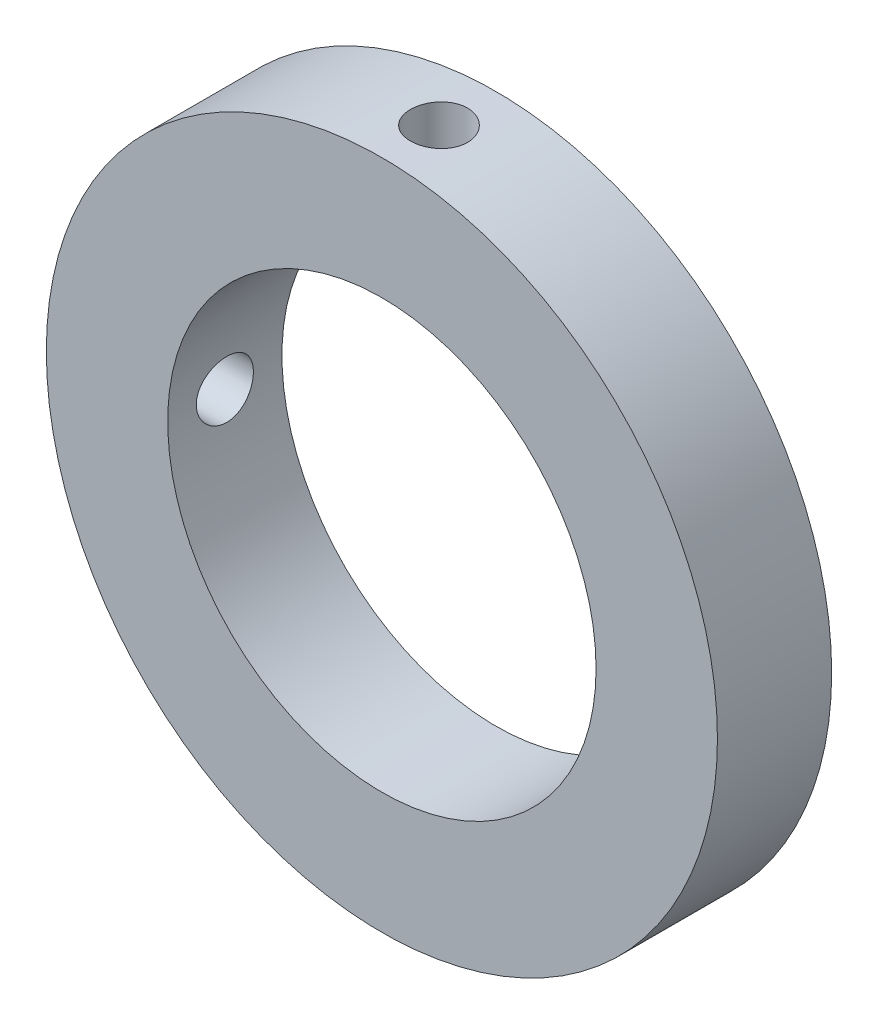
ISO-10303-21;
HEADER;
FILE_DESCRIPTION(('STEP AP214'),'2;1');
FILE_NAME('part.step','',(''),(''),'','','');
FILE_SCHEMA(('AUTOMOTIVE_DESIGN { 1 0 10303 214 1 1 1 1 }'));
ENDSEC;
DATA;
#1=APPLICATION_CONTEXT('core data for automotive mechanical design processes');
#2=APPLICATION_PROTOCOL_DEFINITION('international standard','automotive_design',2000,#1);
#3=PRODUCT_CONTEXT('',#1,'mechanical');
#4=PRODUCT('Part','Part','',(#3));
#5=PRODUCT_RELATED_PRODUCT_CATEGORY('part','',(#4));
#6=PRODUCT_DEFINITION_FORMATION('','',#4);
#7=PRODUCT_DEFINITION_CONTEXT('part definition',#1,'design');
#8=PRODUCT_DEFINITION('design','',#6,#7);
#9=PRODUCT_DEFINITION_SHAPE('','',#8);
#10=(LENGTH_UNIT() NAMED_UNIT(*) SI_UNIT(.MILLI.,.METRE.));
#11=(NAMED_UNIT(*) PLANE_ANGLE_UNIT() SI_UNIT($,.RADIAN.));
#12=(NAMED_UNIT(*) SI_UNIT($,.STERADIAN.) SOLID_ANGLE_UNIT());
#13=UNCERTAINTY_MEASURE_WITH_UNIT(LENGTH_MEASURE(1.E-05),#10,'distance_accuracy_value','');
#14=(GEOMETRIC_REPRESENTATION_CONTEXT(3) GLOBAL_UNCERTAINTY_ASSIGNED_CONTEXT((#13)) GLOBAL_UNIT_ASSIGNED_CONTEXT((#10,
#11,#12)) REPRESENTATION_CONTEXT('',''));
#15=CARTESIAN_POINT('',(0.,0.,0.));
#16=DIRECTION('',(0.,0.,1.));
#17=DIRECTION('',(1.,0.,0.));
#18=AXIS2_PLACEMENT_3D('',#15,#16,#17);
#19=CARTESIAN_POINT('',(0.,0.,8.));
#20=DIRECTION('',(0.,0.,1.));
#21=DIRECTION('',(1.,0.,0.));
#22=AXIS2_PLACEMENT_3D('',#19,#20,#21);
#23=PLANE('',#22);
#24=CARTESIAN_POINT('',(0.,0.,8.));
#25=DIRECTION('',(0.,0.,1.));
#26=DIRECTION('',(1.,0.,0.));
#27=AXIS2_PLACEMENT_3D('',#24,#25,#26);
#28=CIRCLE('',#27,23.5);
#29=CARTESIAN_POINT('',(23.5,0.,8.));
#30=VERTEX_POINT('',#29);
#31=EDGE_CURVE('E10',#30,#30,#28,.T.);
#32=ORIENTED_EDGE('',*,*,#31,.T.);
#33=EDGE_LOOP('',(#32));
#34=FACE_BOUND('',#33,.T.);
#35=CARTESIAN_POINT('',(0.,0.,8.));
#36=DIRECTION('',(0.,0.,1.));
#37=DIRECTION('',(1.,0.,0.));
#38=AXIS2_PLACEMENT_3D('',#35,#36,#37);
#39=CIRCLE('',#38,15.);
#40=CARTESIAN_POINT('',(15.,0.,8.));
#41=VERTEX_POINT('',#40);
#42=EDGE_CURVE('E44',#41,#41,#39,.T.);
#43=ORIENTED_EDGE('',*,*,#42,.F.);
#44=EDGE_LOOP('',(#43));
#45=FACE_BOUND('',#44,.T.);
#46=ADVANCED_FACE('F32',(#34,#45),#23,.T.);
#47=CARTESIAN_POINT('',(0.,0.,0.));
#48=DIRECTION('',(0.,0.,1.));
#49=DIRECTION('',(1.,0.,0.));
#50=AXIS2_PLACEMENT_3D('',#47,#48,#49);
#51=PLANE('',#50);
#52=CARTESIAN_POINT('',(0.,0.,0.));
#53=DIRECTION('',(0.,0.,1.));
#54=DIRECTION('',(1.,0.,0.));
#55=AXIS2_PLACEMENT_3D('',#52,#53,#54);
#56=CIRCLE('',#55,23.5);
#57=CARTESIAN_POINT('',(23.5,0.,0.));
#58=VERTEX_POINT('',#57);
#59=EDGE_CURVE('E37',#58,#58,#56,.T.);
#60=ORIENTED_EDGE('',*,*,#59,.F.);
#61=EDGE_LOOP('',(#60));
#62=FACE_BOUND('',#61,.T.);
#63=CARTESIAN_POINT('',(0.,0.,0.));
#64=DIRECTION('',(0.,0.,1.));
#65=DIRECTION('',(1.,0.,0.));
#66=AXIS2_PLACEMENT_3D('',#63,#64,#65);
#67=CIRCLE('',#66,15.);
#68=CARTESIAN_POINT('',(15.,0.,0.));
#69=VERTEX_POINT('',#68);
#70=EDGE_CURVE('E46',#69,#69,#67,.T.);
#71=ORIENTED_EDGE('',*,*,#70,.T.);
#72=EDGE_LOOP('',(#71));
#73=FACE_BOUND('',#72,.T.);
#74=ADVANCED_FACE('F78',(#62,#73),#51,.F.);
#75=CARTESIAN_POINT('',(0.,0.,8.));
#76=DIRECTION('',(0.,0.,-1.));
#77=DIRECTION('',(-1.,0.,0.));
#78=AXIS2_PLACEMENT_3D('',#75,#76,#77);
#79=CYLINDRICAL_SURFACE('',#78,23.5);
#80=CARTESIAN_POINT('',(-23.5,0.,6.));
#81=CARTESIAN_POINT('',(-23.4999988866651,-0.112123229769201,5.9999951065863));
#82=CARTESIAN_POINT('',(-23.4991890045528,-0.224322573517124,5.99053956778184));
#83=CARTESIAN_POINT('',(-23.4960360928998,-0.445616318942711,5.9529591232625));
#84=CARTESIAN_POINT('',(-23.4936913311316,-0.554707067003033,5.92481312343432));
#85=CARTESIAN_POINT('',(-23.4877336015421,-0.766546616788932,5.85067210537414));
#86=CARTESIAN_POINT('',(-23.4841213561534,-0.869298992076933,5.80468725325));
#87=CARTESIAN_POINT('',(-23.4760336376456,-1.06560228518032,5.69619221437259));
#88=CARTESIAN_POINT('',(-23.4715583479548,-1.1591551518568,5.63368553806174));
#89=CARTESIAN_POINT('',(-23.4622333709441,-1.33467623648226,5.49374233042156));
#90=CARTESIAN_POINT('',(-23.4573828278611,-1.41661669196157,5.41627103247056));
#91=CARTESIAN_POINT('',(-23.4478612006841,-1.56634871816151,5.24867124871695));
#92=CARTESIAN_POINT('',(-23.4431901245209,-1.63413966419486,5.15854220438072));
#93=CARTESIAN_POINT('',(-23.4345471555278,-1.75374279436174,4.96801662969354));
#94=CARTESIAN_POINT('',(-23.4305763378243,-1.80553049840485,4.86760467892561));
#95=CARTESIAN_POINT('',(-23.4237933648585,-1.89150071317162,4.65947102995426));
#96=CARTESIAN_POINT('',(-23.4209811883375,-1.92568354691007,4.55174946590893));
#97=CARTESIAN_POINT('',(-23.4168411560679,-1.97539297186546,4.33233314918643));
#98=CARTESIAN_POINT('',(-23.4155096948281,-1.99096488697627,4.22064873392267));
#99=CARTESIAN_POINT('',(-23.4144704730191,-2.00315047217665,3.99624409167833));
#100=CARTESIAN_POINT('',(-23.4147626807867,-1.99976451196352,3.8835238849395));
#101=CARTESIAN_POINT('',(-23.4169345031215,-1.97416791037035,3.6605581544508));
#102=CARTESIAN_POINT('',(-23.4188099620178,-1.95200654956399,3.55030692712201));
#103=CARTESIAN_POINT('',(-23.4239304529418,-1.88956480016654,3.33509468559295));
#104=CARTESIAN_POINT('',(-23.4271754988499,-1.84928422794199,3.23013372502014));
#105=CARTESIAN_POINT('',(-23.4346743098291,-1.75169237314649,3.02832456138188));
#106=CARTESIAN_POINT('',(-23.4389293815818,-1.69435900466839,2.93148708925001));
#107=CARTESIAN_POINT('',(-23.4479676066852,-1.56430495812446,2.74879112190973));
#108=CARTESIAN_POINT('',(-23.4527507711963,-1.49158395483874,2.66293285881005));
#109=CARTESIAN_POINT('',(-23.4623247268058,-1.33254263304903,2.50434598635165));
#110=CARTESIAN_POINT('',(-23.4671154936328,-1.24617971506071,2.43166009023105));
#111=CARTESIAN_POINT('',(-23.4761503430979,-1.06245464054071,2.3018115673023));
#112=CARTESIAN_POINT('',(-23.4803944253498,-0.96509247623753,2.24464895146223));
#113=CARTESIAN_POINT('',(-23.4878585742677,-0.762104721928345,2.14747219265524));
#114=CARTESIAN_POINT('',(-23.4910785263491,-0.656478208912319,2.10745996838497));
#115=CARTESIAN_POINT('',(-23.4961303162537,-0.439972968097537,2.04574983504057));
#116=CARTESIAN_POINT('',(-23.4979621841253,-0.329094354048099,2.02405152951734));
#117=CARTESIAN_POINT('',(-23.500027546738,-0.105602547297321,1.99963878359273));
#118=CARTESIAN_POINT('',(-23.5002660083826,0.00700415752780351,1.99686535074487));
#119=CARTESIAN_POINT('',(-23.4991309611319,0.231080915574299,2.01022649880017));
#120=CARTESIAN_POINT('',(-23.4977574679292,0.342550979850306,2.026360895634));
#121=CARTESIAN_POINT('',(-23.4935561570261,0.56102182056216,2.07703080729405));
#122=CARTESIAN_POINT('',(-23.4907305028014,0.668028990272134,2.11153895107965));
#123=CARTESIAN_POINT('',(-23.4839422526957,0.87473460698808,2.19794882390526));
#124=CARTESIAN_POINT('',(-23.4799796380928,0.97443293360727,2.24985083936804));
#125=CARTESIAN_POINT('',(-23.4713492002272,1.16395908728834,2.36972320517593));
#126=CARTESIAN_POINT('',(-23.4666796732491,1.25376213711802,2.43773260539869));
#127=CARTESIAN_POINT('',(-23.457165661042,1.42069837886321,2.5878328351477));
#128=CARTESIAN_POINT('',(-23.4523211726434,1.49783134111902,2.66992391986532));
#129=CARTESIAN_POINT('',(-23.4429885150815,1.63744048143301,2.84611338292093));
#130=CARTESIAN_POINT('',(-23.4385013022818,1.69987814155054,2.94024233982311));
#131=CARTESIAN_POINT('',(-23.4304049053355,1.80806012983393,3.13768349819379));
#132=CARTESIAN_POINT('',(-23.4267957121001,1.85380463080429,3.24099560458626));
#133=CARTESIAN_POINT('',(-23.4208694335715,1.92723628091616,3.45373444398497));
#134=CARTESIAN_POINT('',(-23.4185506662762,1.95494694423859,3.56315301176486));
#135=CARTESIAN_POINT('',(-23.4154621934875,1.99160084766112,3.78511044155885));
#136=CARTESIAN_POINT('',(-23.4146924568216,2.00054446542744,3.89764924073553));
#137=CARTESIAN_POINT('',(-23.4147896740478,1.99940595412868,4.1222697751252));
#138=CARTESIAN_POINT('',(-23.415651421826,1.98938434369543,4.23435182429875));
#139=CARTESIAN_POINT('',(-23.4189034453138,1.9507261135546,4.45523470737688));
#140=CARTESIAN_POINT('',(-23.4212937233022,1.922089466093,4.56403553638908));
#141=CARTESIAN_POINT('',(-23.4273321057134,1.84702952037953,4.77527102516025));
#142=CARTESIAN_POINT('',(-23.4309801280582,1.80060738275077,4.87770609982076));
#143=CARTESIAN_POINT('',(-23.4391230974554,1.69130092791677,5.07333883812549));
#144=CARTESIAN_POINT('',(-23.4436180320565,1.62841685272985,5.1665366375455));
#145=CARTESIAN_POINT('',(-23.4529654331836,1.48774412655109,5.34135906815437));
#146=CARTESIAN_POINT('',(-23.4578189478076,1.40991062623021,5.42294755481655));
#147=CARTESIAN_POINT('',(-23.4673270625175,1.24163079387903,5.57193609856443));
#148=CARTESIAN_POINT('',(-23.4719816142385,1.15118141763705,5.63933272127201));
#149=CARTESIAN_POINT('',(-23.4805761121491,0.960055887668371,5.75811883935542));
#150=CARTESIAN_POINT('',(-23.4845146659951,0.859360389579698,5.80947728281281));
#151=CARTESIAN_POINT('',(-23.4912172136603,0.650809957353694,5.89449161165884));
#152=CARTESIAN_POINT('',(-23.4939825543955,0.542963398493627,5.92816780789923));
#153=CARTESIAN_POINT('',(-23.497318663049,0.362069241592788,5.96830256055719));
#154=CARTESIAN_POINT('',(-23.4983195760804,0.290184348421729,5.98017325836303));
#155=CARTESIAN_POINT('',(-23.49966060501,0.145543660818374,5.9960235554232));
#156=CARTESIAN_POINT('',(-23.5000007227519,0.0727878688164575,6.00000317669367));
#157=CARTESIAN_POINT('',(-23.5,0.,6.));
#158=B_SPLINE_CURVE_WITH_KNOTS('',3,(#80,#81,#82,#83,#84,#85,#86,#87,#88,#89,#90,#91,#92,#93,
#94,#95,#96,#97,#98,#99,#100,#101,#102,#103,#104,#105,#106,#107,#108,#109,#110,#111,#112,#113,
#114,#115,#116,#117,#118,#119,#120,#121,#122,#123,#124,#125,#126,#127,#128,#129,#130,#131,#132,
#133,#134,#135,#136,#137,#138,#139,#140,#141,#142,#143,#144,#145,#146,#147,#148,#149,#150,#151,
#152,#153,#154,#155,#156,#157),.UNSPECIFIED.,.T.,.F.,(4,2,2,2,2,2,2,2,2,2,2,2,2,2,2,2,2,2,2,2,2,
2,2,2,2,2,2,2,2,2,2,2,2,2,2,2,2,2,4),(0.,0.336103930248838,0.672587834614635,1.00888026263078,
1.34510129492517,1.68211305898248,2.01913969864039,2.35667936318821,2.69421283432595,
3.03092261110221,3.36762582172775,3.70344800167612,4.03927358517125,4.37553602084552,
4.71180556418502,5.04914672410877,5.38648812238235,5.72386725081368,6.06123907566982,
6.39755876567944,6.7338751816154,7.06969198901707,7.40551432654503,7.74215930136561,
8.07881037758492,8.41633426224793,8.7538546528269,9.09093406673161,9.42800669721777,
9.76400553184259,10.1000048674247,10.4359822805189,10.7719547544546,11.1089513741573,
11.4460294523001,11.7837561664383,12.1210940947636,12.3392857851898,12.5574768668596),.UNSPECIFIED.);
#159=CARTESIAN_POINT('',(-23.5,0.,6.));
#160=VERTEX_POINT('',#159);
#161=EDGE_CURVE('E95',#160,#160,#158,.T.);
#162=ORIENTED_EDGE('',*,*,#161,.T.);
#163=EDGE_LOOP('',(#162));
#164=FACE_BOUND('',#163,.T.);
#165=CARTESIAN_POINT('',(0.,23.5,6.));
#166=CARTESIAN_POINT('',(-0.112123229769201,23.4999988866651,5.9999951065863));
#167=CARTESIAN_POINT('',(-0.224322573517124,23.4991890045528,5.99053956778183));
#168=CARTESIAN_POINT('',(-0.445616318942709,23.4960360928998,5.95295912326248));
#169=CARTESIAN_POINT('',(-0.55470706700303,23.4936913311316,5.9248131234343));
#170=CARTESIAN_POINT('',(-0.766546616788927,23.4877336015421,5.8506721053741));
#171=CARTESIAN_POINT('',(-0.869298992076925,23.4841213561534,5.80468725324997));
#172=CARTESIAN_POINT('',(-1.06560228518031,23.4760336376456,5.69619221437255));
#173=CARTESIAN_POINT('',(-1.15915515185679,23.4715583479548,5.63368553806169));
#174=CARTESIAN_POINT('',(-1.33467623648224,23.4622333709441,5.4937423304215));
#175=CARTESIAN_POINT('',(-1.41661669196155,23.4573828278611,5.4162710324705));
#176=CARTESIAN_POINT('',(-1.56634871816148,23.4478612006841,5.24867124871689));
#177=CARTESIAN_POINT('',(-1.63413966419483,23.4431901245209,5.15854220438065));
#178=CARTESIAN_POINT('',(-1.7537427943617,23.4345471555278,4.96801662969347));
#179=CARTESIAN_POINT('',(-1.8055304984048,23.4305763378243,4.86760467892553));
#180=CARTESIAN_POINT('',(-1.89150071317157,23.4237933648585,4.65947102995418));
#181=CARTESIAN_POINT('',(-1.92568354691001,23.4209811883375,4.55174946590885));
#182=CARTESIAN_POINT('',(-1.97539297186539,23.4168411560679,4.33233314918635));
#183=CARTESIAN_POINT('',(-1.9909648869762,23.4155096948281,4.22064873392259));
#184=CARTESIAN_POINT('',(-2.00315047217657,23.4144704730191,3.99624409167825));
#185=CARTESIAN_POINT('',(-1.99976451196344,23.4147626807867,3.88352388493942));
#186=CARTESIAN_POINT('',(-1.97416791037025,23.4169345031215,3.66055815445072));
#187=CARTESIAN_POINT('',(-1.95200654956388,23.4188099620178,3.55030692712193));
#188=CARTESIAN_POINT('',(-1.88956480016643,23.4239304529418,3.33509468559287));
#189=CARTESIAN_POINT('',(-1.84928422794187,23.4271754988499,3.23013372502007));
#190=CARTESIAN_POINT('',(-1.75169237314637,23.4346743098291,3.02832456138181));
#191=CARTESIAN_POINT('',(-1.69435900466827,23.4389293815818,2.93148708924994));
#192=CARTESIAN_POINT('',(-1.56430495812433,23.4479676066853,2.74879112190967));
#193=CARTESIAN_POINT('',(-1.4915839548386,23.4527507711963,2.66293285880999));
#194=CARTESIAN_POINT('',(-1.33254263304889,23.4623247268058,2.5043459863516));
#195=CARTESIAN_POINT('',(-1.24617971506056,23.4671154936328,2.43166009023099));
#196=CARTESIAN_POINT('',(-1.06245464054056,23.4761503430979,2.30181156730226));
#197=CARTESIAN_POINT('',(-0.965092476237375,23.4803944253498,2.24464895146219));
#198=CARTESIAN_POINT('',(-0.762104721928186,23.4878585742677,2.14747219265521));
#199=CARTESIAN_POINT('',(-0.656478208912159,23.4910785263491,2.10745996838494));
#200=CARTESIAN_POINT('',(-0.439972968097374,23.4961303162537,2.04574983504055));
#201=CARTESIAN_POINT('',(-0.329094354047935,23.4979621841253,2.02405152951733));
#202=CARTESIAN_POINT('',(-0.105602547297156,23.500027546738,1.99963878359273));
#203=CARTESIAN_POINT('',(0.00700415752796867,23.5002660083826,1.99686535074487));
#204=CARTESIAN_POINT('',(0.231080915574463,23.4991309611319,2.01022649880018));
#205=CARTESIAN_POINT('',(0.34255097985047,23.4977574679291,2.02636089563401));
#206=CARTESIAN_POINT('',(0.561021820562321,23.4935561570261,2.07703080729407));
#207=CARTESIAN_POINT('',(0.668028990272294,23.4907305028014,2.11153895107967));
#208=CARTESIAN_POINT('',(0.874734606988236,23.4839422526957,2.19794882390529));
#209=CARTESIAN_POINT('',(0.974432933607424,23.4799796380928,2.24985083936808));
#210=CARTESIAN_POINT('',(1.16395908728849,23.4713492002272,2.36972320517597));
#211=CARTESIAN_POINT('',(1.25376213711817,23.4666796732491,2.43773260539874));
#212=CARTESIAN_POINT('',(1.42069837886335,23.457165661042,2.58783283514776));
#213=CARTESIAN_POINT('',(1.49783134111915,23.4523211726434,2.66992391986539));
#214=CARTESIAN_POINT('',(1.63744048143314,23.4429885150815,2.84611338292099));
#215=CARTESIAN_POINT('',(1.69987814155066,23.4385013022818,2.94024233982318));
#216=CARTESIAN_POINT('',(1.80806012983404,23.4304049053355,3.13768349819387));
#217=CARTESIAN_POINT('',(1.8538046308044,23.4267957121001,3.24099560458634));
#218=CARTESIAN_POINT('',(1.92723628091627,23.4208694335715,3.45373444398504));
#219=CARTESIAN_POINT('',(1.95494694423869,23.4185506662762,3.56315301176494));
#220=CARTESIAN_POINT('',(1.99160084766121,23.4154621934875,3.78511044155893));
#221=CARTESIAN_POINT('',(2.00054446542752,23.4146924568216,3.89764924073561));
#222=CARTESIAN_POINT('',(1.99940595412876,23.4147896740478,4.12226977512528));
#223=CARTESIAN_POINT('',(1.9893843436955,23.415651421826,4.23435182429883));
#224=CARTESIAN_POINT('',(1.95072611355466,23.4189034453138,4.45523470737696));
#225=CARTESIAN_POINT('',(1.92208946609306,23.4212937233022,4.56403553638916));
#226=CARTESIAN_POINT('',(1.84702952037958,23.4273321057134,4.77527102516033));
#227=CARTESIAN_POINT('',(1.80060738275082,23.4309801280582,4.87770609982083));
#228=CARTESIAN_POINT('',(1.69130092791681,23.4391230974554,5.07333883812556));
#229=CARTESIAN_POINT('',(1.62841685272988,23.4436180320565,5.16653663754557));
#230=CARTESIAN_POINT('',(1.48774412655112,23.4529654331836,5.34135906815443));
#231=CARTESIAN_POINT('',(1.40991062623023,23.4578189478076,5.42294755481661));
#232=CARTESIAN_POINT('',(1.24163079387905,23.4673270625175,5.57193609856448));
#233=CARTESIAN_POINT('',(1.15118141763707,23.4719816142385,5.63933272127205));
#234=CARTESIAN_POINT('',(0.96005588766838,23.4805761121491,5.75811883935546));
#235=CARTESIAN_POINT('',(0.859360389579704,23.4845146659951,5.80947728281285));
#236=CARTESIAN_POINT('',(0.650809957353696,23.4912172136603,5.89449161165887));
#237=CARTESIAN_POINT('',(0.542963398493629,23.4939825543955,5.92816780789926));
#238=CARTESIAN_POINT('',(0.362069241592788,23.497318663049,5.96830256055721));
#239=CARTESIAN_POINT('',(0.29018434842173,23.4983195760804,5.98017325836304));
#240=CARTESIAN_POINT('',(0.145543660818374,23.49966060501,5.99602355542321));
#241=CARTESIAN_POINT('',(0.0727878688164576,23.5000007227519,6.00000317669367));
#242=CARTESIAN_POINT('',(0.,23.5,6.));
#243=B_SPLINE_CURVE_WITH_KNOTS('',3,(#165,#166,#167,#168,#169,#170,#171,#172,#173,#174,#175,
#176,#177,#178,#179,#180,#181,#182,#183,#184,#185,#186,#187,#188,#189,#190,#191,#192,#193,#194,
#195,#196,#197,#198,#199,#200,#201,#202,#203,#204,#205,#206,#207,#208,#209,#210,#211,#212,#213,
#214,#215,#216,#217,#218,#219,#220,#221,#222,#223,#224,#225,#226,#227,#228,#229,#230,#231,#232,
#233,#234,#235,#236,#237,#238,#239,#240,#241,#242),.UNSPECIFIED.,.T.,.F.,(4,2,2,2,2,2,2,2,2,2,2,
2,2,2,2,2,2,2,2,2,2,2,2,2,2,2,2,2,2,2,2,2,2,2,2,2,2,2,4),(0.,0.336103930248838,
0.672587834614635,1.00888026263078,1.34510129492518,1.68211305898248,2.01913969864039,
2.35667936318821,2.69421283432595,3.03092261110221,3.36762582172775,3.70344800167612,
4.03927358517125,4.37553602084552,4.71180556418502,5.04914672410877,5.38648812238235,
5.72386725081368,6.06123907566982,6.39755876567944,6.7338751816154,7.06969198901707,
7.40551432654503,7.74215930136561,8.07881037758492,8.41633426224793,8.7538546528269,
9.09093406673161,9.42800669721777,9.76400553184259,10.1000048674247,10.4359822805189,
10.7719547544546,11.1089513741573,11.4460294523001,11.7837561664383,12.1210940947636,
12.3392857851898,12.5574768668596),.UNSPECIFIED.);
#244=CARTESIAN_POINT('',(0.,23.5,6.));
#245=VERTEX_POINT('',#244);
#246=EDGE_CURVE('E49',#245,#245,#243,.T.);
#247=ORIENTED_EDGE('',*,*,#246,.T.);
#248=EDGE_LOOP('',(#247));
#249=FACE_BOUND('',#248,.T.);
#250=ORIENTED_EDGE('',*,*,#31,.F.);
#251=EDGE_LOOP('',(#250));
#252=FACE_BOUND('',#251,.T.);
#253=ORIENTED_EDGE('',*,*,#59,.T.);
#254=EDGE_LOOP('',(#253));
#255=FACE_BOUND('',#254,.T.);
#256=ADVANCED_FACE('F34',(#164,#249,#252,#255),#79,.T.);
#257=CARTESIAN_POINT('',(0.,0.,8.));
#258=DIRECTION('',(0.,0.,-1.));
#259=DIRECTION('',(-1.,0.,0.));
#260=AXIS2_PLACEMENT_3D('',#257,#258,#259);
#261=CYLINDRICAL_SURFACE('',#260,15.);
#262=CARTESIAN_POINT('',(-14.8660687473185,-2.00000000000005,4.));
#263=CARTESIAN_POINT('',(-14.8660704451043,-1.99999528594764,4.11180385546753));
#264=CARTESIAN_POINT('',(-14.8673436464034,-1.99059326704133,4.22367603311622));
#265=CARTESIAN_POINT('',(-14.8722964859732,-1.95323796266135,4.44430246233589));
#266=CARTESIAN_POINT('',(-14.8759785863295,-1.92526569649118,4.5530534049172));
#267=CARTESIAN_POINT('',(-14.8853249214529,-1.85161311140269,4.76421136822632));
#268=CARTESIAN_POINT('',(-14.8909877556206,-1.8059453027505,4.86662281161769));
#269=CARTESIAN_POINT('',(-14.9036558225185,-1.69822564880692,5.06231107570956));
#270=CARTESIAN_POINT('',(-14.9106608397868,-1.63617643263474,5.15558935893803));
#271=CARTESIAN_POINT('',(-14.9252737732073,-1.49703370489523,5.33097345466847));
#272=CARTESIAN_POINT('',(-14.9328848849373,-1.41985682274865,5.41301286567938));
#273=CARTESIAN_POINT('',(-14.9478237625824,-1.25282922872615,5.56301624545638));
#274=CARTESIAN_POINT('',(-14.9551515139324,-1.16297786647203,5.63097949147619));
#275=CARTESIAN_POINT('',(-14.9687309976037,-0.972731724927664,5.7511418417164));
#276=CARTESIAN_POINT('',(-14.9749785650228,-0.872298437711274,5.80328048929025));
#277=CARTESIAN_POINT('',(-14.9856585341581,-0.664003816037419,5.8899261641808));
#278=CARTESIAN_POINT('',(-14.990091012146,-0.556142793922452,5.92443393237768));
#279=CARTESIAN_POINT('',(-14.9966188619561,-0.336735375014141,5.97463890958027));
#280=CARTESIAN_POINT('',(-14.9987279820508,-0.22521472346995,5.99044681501196));
#281=CARTESIAN_POINT('',(-15.0004184797152,-0.00108500230370847,6.00314660873682));
#282=CARTESIAN_POINT('',(-14.9999999696283,0.111524018722414,6.00003933773652));
#283=CARTESIAN_POINT('',(-14.9966934411691,0.333880124465717,5.97508526945905));
#284=CARTESIAN_POINT('',(-14.9938211133781,0.443640837361733,5.95335753525435));
#285=CARTESIAN_POINT('',(-14.9859472409229,0.657944122712502,5.89196567297849));
#286=CARTESIAN_POINT('',(-14.9809456511403,0.762486584541787,5.85230116483189));
#287=CARTESIAN_POINT('',(-14.9693481900416,0.963751808424076,5.75603655887818));
#288=CARTESIAN_POINT('',(-14.9627475214588,1.06044984935321,5.69938537681692));
#289=CARTESIAN_POINT('',(-14.9486895041904,1.24301169073473,5.57079274271714));
#290=CARTESIAN_POINT('',(-14.9412321108429,1.32887492586676,5.4988504933722));
#291=CARTESIAN_POINT('',(-14.9262258809566,1.48803006154534,5.34105215164107));
#292=CARTESIAN_POINT('',(-14.918676784244,1.56121903353016,5.25509223180637));
#293=CARTESIAN_POINT('',(-14.9043949876924,1.69214693057186,5.07205406862743));
#294=CARTESIAN_POINT('',(-14.8976622910908,1.74988579436348,4.97497578119703));
#295=CARTESIAN_POINT('',(-14.8857757633434,1.84828286086495,4.7723599996533));
#296=CARTESIAN_POINT('',(-14.8806227621479,1.88893208906701,4.66681809548151));
#297=CARTESIAN_POINT('',(-14.8724947546572,1.95190090044919,4.45032197936162));
#298=CARTESIAN_POINT('',(-14.8695196283616,1.97422149354138,4.33936806597344));
#299=CARTESIAN_POINT('',(-14.8661064501035,1.99976160768722,4.11610866499504));
#300=CARTESIAN_POINT('',(-14.8656491151163,2.00312631098807,4.00382006966746));
#301=CARTESIAN_POINT('',(-14.867272242967,1.99104288188791,3.78028074389526));
#302=CARTESIAN_POINT('',(-14.8693526440475,1.97559520729771,3.66902998826055));
#303=CARTESIAN_POINT('',(-14.8757992043677,1.92644805037014,3.45116401359439));
#304=CARTESIAN_POINT('',(-14.8801564778765,1.89281950323355,3.3445325069819));
#305=CARTESIAN_POINT('',(-14.8906585901441,1.8083384508012,3.13842108654756));
#306=CARTESIAN_POINT('',(-14.8968034998284,1.75748526209378,3.03894145667628));
#307=CARTESIAN_POINT('',(-14.9102344661952,1.63964406417206,2.84930268955919));
#308=CARTESIAN_POINT('',(-14.9175271378913,1.57256123166295,2.75920295163176));
#309=CARTESIAN_POINT('',(-14.9324114351651,1.42429832312794,2.59148906156291));
#310=CARTESIAN_POINT('',(-14.9400030739993,1.34311762143749,2.51387546385198));
#311=CARTESIAN_POINT('',(-14.9546894865533,1.16832754835818,2.37282344607888));
#312=CARTESIAN_POINT('',(-14.9617807004972,1.07464064093247,2.30948068362839));
#313=CARTESIAN_POINT('',(-14.974613414783,0.877872452317567,2.19943171782467));
#314=CARTESIAN_POINT('',(-14.9803549454849,0.774791382513647,2.15272514024389));
#315=CARTESIAN_POINT('',(-14.9898256469115,0.56247277252338,2.07743073841187));
#316=CARTESIAN_POINT('',(-14.9935608482078,0.453254784247309,2.04878857091645));
#317=CARTESIAN_POINT('',(-14.9986231668662,0.231506493423145,2.01025951453902));
#318=CARTESIAN_POINT('',(-14.9999504085613,0.11897636219977,2.00037165729229));
#319=CARTESIAN_POINT('',(-15.0000464724842,-0.105269873711641,1.99965173275968));
#320=CARTESIAN_POINT('',(-14.9988350491343,-0.216985525921932,2.00867252940561));
#321=CARTESIAN_POINT('',(-14.9940293321986,-0.437297443052405,2.04520104123198));
#322=CARTESIAN_POINT('',(-14.9904350419501,-0.545893712341099,2.0727087305213));
#323=CARTESIAN_POINT('',(-14.9812655664247,-0.756858234588912,2.14538204707667));
#324=CARTESIAN_POINT('',(-14.9756912840831,-0.859229301543963,2.19053962640806));
#325=CARTESIAN_POINT('',(-14.9631774939599,-1.05496407863093,2.29721554964574));
#326=CARTESIAN_POINT('',(-14.95623796097,-1.14832762239922,2.35873419565244));
#327=CARTESIAN_POINT('',(-14.9417029120984,-1.32414728606679,2.49692668200364));
#328=CARTESIAN_POINT('',(-14.9341029029987,-1.40651715716405,2.57370979013919));
#329=CARTESIAN_POINT('',(-14.919138648968,-1.55725895587221,2.74002306904736));
#330=CARTESIAN_POINT('',(-14.911774460102,-1.62562757530237,2.82955624392126));
#331=CARTESIAN_POINT('',(-14.8980810988492,-1.746687909785,3.01928394157089));
#332=CARTESIAN_POINT('',(-14.8917566176026,-1.79930940429131,3.1195235915101));
#333=CARTESIAN_POINT('',(-14.8809136658427,-1.88689518281496,3.32744846751705));
#334=CARTESIAN_POINT('',(-14.8763932602426,-1.92187839666371,3.43512556975937));
#335=CARTESIAN_POINT('',(-14.8707513382361,-1.96495480378588,3.61944827872554));
#336=CARTESIAN_POINT('',(-14.8690042861798,-1.97807748135808,3.69493827296814));
#337=CARTESIAN_POINT('',(-14.866662414787,-1.99560165343187,3.8469415094705));
#338=CARTESIAN_POINT('',(-14.8660675849485,-2.00000322742325,3.92345474239741));
#339=CARTESIAN_POINT('',(-14.8660687473185,-2.00000000000005,4.));
#340=B_SPLINE_CURVE_WITH_KNOTS('',3,(#262,#263,#264,#265,#266,#267,#268,#269,#270,#271,#272,
#273,#274,#275,#276,#277,#278,#279,#280,#281,#282,#283,#284,#285,#286,#287,#288,#289,#290,#291,
#292,#293,#294,#295,#296,#297,#298,#299,#300,#301,#302,#303,#304,#305,#306,#307,#308,#309,#310,
#311,#312,#313,#314,#315,#316,#317,#318,#319,#320,#321,#322,#323,#324,#325,#326,#327,#328,#329,
#330,#331,#332,#333,#334,#335,#336,#337,#338,#339),.UNSPECIFIED.,.T.,.F.,(4,2,2,2,2,2,2,2,2,2,2,
2,2,2,2,2,2,2,2,2,2,2,2,2,2,2,2,2,2,2,2,2,2,2,2,2,2,2,4),(0.,0.335131889250449,
0.670606846105683,1.00584506276825,1.34102950834956,1.67811595121165,2.01521969762238,
2.35359556525146,2.69195721256928,3.02830569524969,3.36463922864856,3.69883808669953,
4.03304402666679,4.36826528456251,4.70350402584628,5.04134915068959,5.37919561519091,
5.71721927655741,6.05522431149102,6.3906370258193,6.72604157783542,7.06014684818595,
7.3942653761821,7.73038528142333,8.06652010750621,8.40484511764504,8.74316251675152,
9.08045723770335,9.41773454222147,9.752397098563,10.0870591862064,10.4215688535019,
10.7560846978108,11.0930874236894,11.430169684094,11.768733419821,12.1069330231324,
12.3363794094425,12.5658237044201),.UNSPECIFIED.);
#341=CARTESIAN_POINT('',(-14.8660687473185,-2.00000000000005,4.));
#342=VERTEX_POINT('',#341);
#343=EDGE_CURVE('E100',#342,#342,#340,.T.);
#344=ORIENTED_EDGE('',*,*,#343,.T.);
#345=EDGE_LOOP('',(#344));
#346=FACE_BOUND('',#345,.T.);
#347=CARTESIAN_POINT('',(0.,15.,6.));
#348=CARTESIAN_POINT('',(0.111808835669284,14.9999983574254,5.99999529029309));
#349=CARTESIAN_POINT('',(0.22368597927628,14.9987367072719,5.99059246203753));
#350=CARTESIAN_POINT('',(0.444322725138079,14.993825111269,5.95323365095044));
#351=CARTESIAN_POINT('',(0.553079022333037,14.9901727244172,5.92525870510285));
#352=CARTESIAN_POINT('',(0.764248312626984,14.9808907984907,5.85159828245855));
#353=CARTESIAN_POINT('',(0.866665683058494,14.9752626421097,5.80592518896156));
#354=CARTESIAN_POINT('',(1.0623638950303,14.9626538666039,5.69819308619372));
#355=CARTESIAN_POINT('',(1.15564620633702,14.9556734655857,5.63613671883354));
#356=CARTESIAN_POINT('',(1.33102582250468,14.9410899478996,5.49698673839582));
#357=CARTESIAN_POINT('',(1.41305798549586,14.9334835816211,5.41981135499153));
#358=CARTESIAN_POINT('',(1.56304735673102,14.9185313755795,5.25278981092335));
#359=CARTESIAN_POINT('',(1.63100381997221,14.9111855496234,5.16294298000419));
#360=CARTESIAN_POINT('',(1.75115902268907,14.8975543544019,4.97270087705497));
#361=CARTESIAN_POINT('',(1.80329607482578,14.8912731776576,4.87226631752138));
#362=CARTESIAN_POINT('',(1.8899384500729,14.8805258737923,4.66396893276321));
#363=CARTESIAN_POINT('',(1.92444453245278,14.8760596685121,4.55610642764669));
#364=CARTESIAN_POINT('',(1.97464606772174,14.8694793656867,4.33669418949834));
#365=CARTESIAN_POINT('',(1.99045204228506,14.8673514537014,4.22517016546708));
#366=CARTESIAN_POINT('',(2.00314680548117,14.8656465160931,4.00103382039405));
#367=CARTESIAN_POINT('',(2.00003645633601,14.866069374204,3.8884215491891));
#368=CARTESIAN_POINT('',(1.97507745939234,14.8694055577299,3.66607886997207));
#369=CARTESIAN_POINT('',(1.95335097531762,14.8723026462234,3.5563344701143));
#370=CARTESIAN_POINT('',(1.89196724634371,14.8802355277475,3.34206316323991));
#371=CARTESIAN_POINT('',(1.85230959261457,14.8852713695413,3.23753637524499));
#372=CARTESIAN_POINT('',(1.75605929143191,14.8969326111103,3.0362903652928));
#373=CARTESIAN_POINT('',(1.69941397913749,14.903562941239,2.93959662880569));
#374=CARTESIAN_POINT('',(1.57083393344289,14.9176623621993,2.75704091808234));
#375=CARTESIAN_POINT('',(1.49889840502385,14.9251314966353,2.67117950744583));
#376=CARTESIAN_POINT('',(1.34110490026362,14.9401389923359,2.5120169874181));
#377=CARTESIAN_POINT('',(1.25514170702645,14.947677435412,2.43882015729767));
#378=CARTESIAN_POINT('',(1.07209417013341,14.9619192381826,2.30787795507161));
#379=CARTESIAN_POINT('',(0.97500979444237,14.9686225954715,2.25013262747648));
#380=CARTESIAN_POINT('',(0.77239221973047,14.9804439374358,2.15173088230526));
#381=CARTESIAN_POINT('',(0.666855578841231,14.9855612720896,2.11108146895369));
#382=CARTESIAN_POINT('',(0.45037092433625,14.9936282590407,2.04811068102765));
#383=CARTESIAN_POINT('',(0.339423199542258,14.9965780268993,2.02578832936061));
#384=CARTESIAN_POINT('',(0.116166903325644,14.9999624137686,2.00024156722888));
#385=CARTESIAN_POINT('',(0.0038750345470432,15.0004159384905,1.99687359821651));
#386=CARTESIAN_POINT('',(-0.219671617218717,14.9988079153852,2.00895166412718));
#387=CARTESIAN_POINT('',(-0.330926425345664,14.996746428686,2.02439724178236));
#388=CARTESIAN_POINT('',(-0.548813715572937,14.990351753581,2.07354465338398));
#389=CARTESIAN_POINT('',(-0.655462016512044,14.9860271430292,2.10717756832215));
#390=CARTESIAN_POINT('',(-0.861605098793558,14.9755900925429,2.19167296593709));
#391=CARTESIAN_POINT('',(-0.961099607015637,14.9694775843944,2.24253610601325));
#392=CARTESIAN_POINT('',(-1.15074887861608,14.9560983737007,2.36039215558331));
#393=CARTESIAN_POINT('',(-1.2408458143966,14.9488251504572,2.42747736571333));
#394=CARTESIAN_POINT('',(-1.4085529469919,14.9339572870998,2.57574332922425));
#395=CARTESIAN_POINT('',(-1.48616257662378,14.9263626324062,2.65692472251643));
#396=CARTESIAN_POINT('',(-1.62720549423098,14.9116490247351,2.83171314263955));
#397=CARTESIAN_POINT('',(-1.69054327608938,14.904533487753,2.92539756673816));
#398=CARTESIAN_POINT('',(-1.80058351078814,14.8916413300182,3.12215941028092));
#399=CARTESIAN_POINT('',(-1.84728633510346,14.8858646793678,3.22523661991038));
#400=CARTESIAN_POINT('',(-1.92257836500746,14.8763281178008,3.43755724202769));
#401=CARTESIAN_POINT('',(-1.95122028846795,14.872562342326,3.5467816852108));
#402=CARTESIAN_POINT('',(-1.98974667143959,14.8674574869829,3.76854363212876));
#403=CARTESIAN_POINT('',(-1.99963213426782,14.8661182773134,3.88108095832443));
#404=CARTESIAN_POINT('',(-2.00034485806189,14.8660223129545,4.10532349085351));
#405=CARTESIAN_POINT('',(-1.99132219194493,14.8672452228252,4.21702824096424));
#406=CARTESIAN_POINT('',(-1.95479376686689,14.872091838742,4.43731787510387));
#407=CARTESIAN_POINT('',(-1.92728801483269,14.8757155438883,4.54590276030197));
#408=CARTESIAN_POINT('',(-1.85462310332207,14.8849489027276,4.75684368325159));
#409=CARTESIAN_POINT('',(-1.80947220819041,14.890557626594,4.85920261111686));
#410=CARTESIAN_POINT('',(-1.70281342759737,14.9031304571282,5.05491588382606));
#411=CARTESIAN_POINT('',(-1.64130522630429,14.910094589966,5.14827005475604));
#412=CARTESIAN_POINT('',(-1.50312448509508,14.9246596718306,5.32408964992841));
#413=CARTESIAN_POINT('',(-1.42634027226901,14.9322650575408,5.40646694775513));
#414=CARTESIAN_POINT('',(-1.26002169349824,14.9472171900166,5.55722321636154));
#415=CARTESIAN_POINT('',(-1.17048434072978,14.9545638756898,5.62559889875025));
#416=CARTESIAN_POINT('',(-0.980752987852823,14.9682063513753,5.74666713846652));
#417=CARTESIAN_POINT('',(-0.880514620743967,14.9744974642689,5.79929066655524));
#418=CARTESIAN_POINT('',(-0.67259240958733,14.9852732065897,5.88688059854508));
#419=CARTESIAN_POINT('',(-0.564916678969891,14.9897597692431,5.92186590862486));
#420=CARTESIAN_POINT('',(-0.38058840809842,14.9953572174327,5.96494800638518));
#421=CARTESIAN_POINT('',(-0.305091081955779,14.9970896363507,5.97807324352364));
#422=CARTESIAN_POINT('',(-0.153073171616112,14.9994115849077,5.99560081416547));
#423=CARTESIAN_POINT('',(-0.0765525964512404,15.000001124628,6.0000032246136));
#424=CARTESIAN_POINT('',(0.,15.,6.));
#425=B_SPLINE_CURVE_WITH_KNOTS('',3,(#347,#348,#349,#350,#351,#352,#353,#354,#355,#356,#357,
#358,#359,#360,#361,#362,#363,#364,#365,#366,#367,#368,#369,#370,#371,#372,#373,#374,#375,#376,
#377,#378,#379,#380,#381,#382,#383,#384,#385,#386,#387,#388,#389,#390,#391,#392,#393,#394,#395,
#396,#397,#398,#399,#400,#401,#402,#403,#404,#405,#406,#407,#408,#409,#410,#411,#412,#413,#414,
#415,#416,#417,#418,#419,#420,#421,#422,#423,#424),.UNSPECIFIED.,.T.,.F.,(4,2,2,2,2,2,2,2,2,2,2,
2,2,2,2,2,2,2,2,2,2,2,2,2,2,2,2,2,2,2,2,2,2,2,2,2,2,2,4),(0.,0.335146851305743,
0.670636430885044,1.0058916928274,1.34109292564035,1.67815978443559,2.01524447904836,
2.35362721511647,2.69199537766205,3.02835355914359,3.3646964092492,3.69884885098043,
4.0330089117585,4.36821583137897,4.70344018443797,5.04130544484849,5.37917167852296,
5.71717620202538,6.05516270391743,6.39058584992061,6.72600084354478,7.06015363396463,
7.39431917503546,7.73043274769884,8.06656158258761,8.4048770453545,8.74318495273048,
9.08050074735454,9.41779849783634,9.75242927496624,10.0870599266874,10.4215340370262,
10.756014605959,11.0930366783511,11.4301378125116,11.7686952667452,12.1068890499242,
12.3363573904731,12.5658237068544),.UNSPECIFIED.);
#426=CARTESIAN_POINT('',(0.,15.,6.));
#427=VERTEX_POINT('',#426);
#428=EDGE_CURVE('E58',#427,#427,#425,.T.);
#429=ORIENTED_EDGE('',*,*,#428,.T.);
#430=EDGE_LOOP('',(#429));
#431=FACE_BOUND('',#430,.T.);
#432=ORIENTED_EDGE('',*,*,#42,.T.);
#433=EDGE_LOOP('',(#432));
#434=FACE_BOUND('',#433,.T.);
#435=ORIENTED_EDGE('',*,*,#70,.F.);
#436=EDGE_LOOP('',(#435));
#437=FACE_BOUND('',#436,.T.);
#438=ADVANCED_FACE('F69',(#346,#431,#434,#437),#261,.F.);
#439=CARTESIAN_POINT('',(0.,-23.501,4.));
#440=DIRECTION('',(0.,1.,0.));
#441=DIRECTION('',(0.,0.,1.));
#442=AXIS2_PLACEMENT_3D('',#439,#440,#441);
#443=CYLINDRICAL_SURFACE('',#442,2.);
#444=ORIENTED_EDGE('',*,*,#428,.F.);
#445=EDGE_LOOP('',(#444));
#446=FACE_BOUND('',#445,.T.);
#447=ORIENTED_EDGE('',*,*,#246,.F.);
#448=EDGE_LOOP('',(#447));
#449=FACE_BOUND('',#448,.T.);
#450=ADVANCED_FACE('F64',(#446,#449),#443,.F.);
#451=CARTESIAN_POINT('',(23.5010000000001,0.,4.));
#452=DIRECTION('',(-1.,0.,0.));
#453=DIRECTION('',(0.,-1.,0.));
#454=AXIS2_PLACEMENT_3D('',#451,#452,#453);
#455=CYLINDRICAL_SURFACE('',#454,2.);
#456=ORIENTED_EDGE('',*,*,#343,.F.);
#457=EDGE_LOOP('',(#456));
#458=FACE_BOUND('',#457,.T.);
#459=ORIENTED_EDGE('',*,*,#161,.F.);
#460=EDGE_LOOP('',(#459));
#461=FACE_BOUND('',#460,.T.);
#462=ADVANCED_FACE('F68',(#458,#461),#455,.F.);
#463=CLOSED_SHELL('',(#46,#74,#256,#438,#450,#462));
#464=MANIFOLD_SOLID_BREP('B2',#463);
#465=ADVANCED_BREP_SHAPE_REPRESENTATION('',(#18,#464),#14);
#466=SHAPE_DEFINITION_REPRESENTATION(#9,#465);
ENDSEC;
END-ISO-10303-21;
